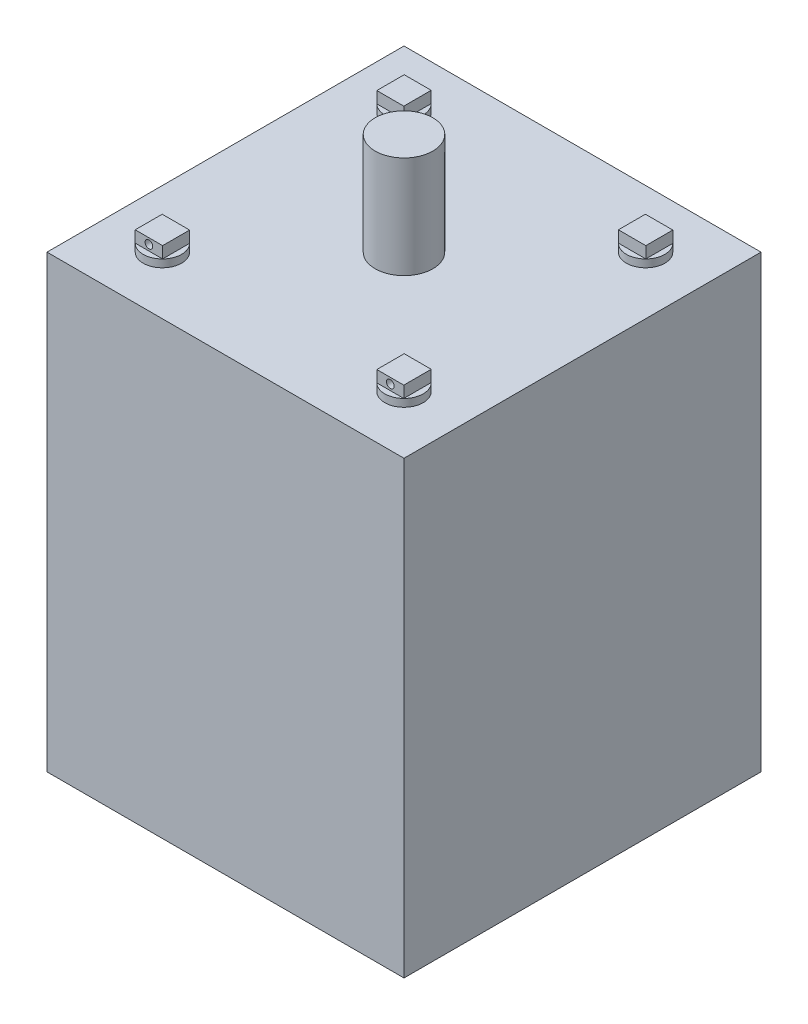
ISO-10303-21;
HEADER;
FILE_DESCRIPTION(('STEP AP214'),'2;1');
FILE_NAME('part.step','',(''),(''),'','','');
FILE_SCHEMA(('AUTOMOTIVE_DESIGN { 1 0 10303 214 1 1 1 1 }'));
ENDSEC;
DATA;
#1=APPLICATION_CONTEXT('core data for automotive mechanical design processes');
#2=APPLICATION_PROTOCOL_DEFINITION('international standard','automotive_design',2000,#1);
#3=PRODUCT_CONTEXT('',#1,'mechanical');
#4=PRODUCT('Part','Part','',(#3));
#5=PRODUCT_RELATED_PRODUCT_CATEGORY('part','',(#4));
#6=PRODUCT_DEFINITION_FORMATION('','',#4);
#7=PRODUCT_DEFINITION_CONTEXT('part definition',#1,'design');
#8=PRODUCT_DEFINITION('design','',#6,#7);
#9=PRODUCT_DEFINITION_SHAPE('','',#8);
#10=(LENGTH_UNIT() NAMED_UNIT(*) SI_UNIT(.MILLI.,.METRE.));
#11=(NAMED_UNIT(*) PLANE_ANGLE_UNIT() SI_UNIT($,.RADIAN.));
#12=(NAMED_UNIT(*) SI_UNIT($,.STERADIAN.) SOLID_ANGLE_UNIT());
#13=UNCERTAINTY_MEASURE_WITH_UNIT(LENGTH_MEASURE(1.E-05),#10,'distance_accuracy_value','');
#14=(GEOMETRIC_REPRESENTATION_CONTEXT(3) GLOBAL_UNCERTAINTY_ASSIGNED_CONTEXT((#13)) GLOBAL_UNIT_ASSIGNED_CONTEXT((#10,
#11,#12)) REPRESENTATION_CONTEXT('',''));
#15=CARTESIAN_POINT('',(0.,0.,0.));
#16=DIRECTION('',(0.,0.,1.));
#17=DIRECTION('',(1.,0.,0.));
#18=AXIS2_PLACEMENT_3D('',#15,#16,#17);
#19=CARTESIAN_POINT('',(92.7999999999995,119.,4.85722573273506E-13));
#20=DIRECTION('',(0.,1.,0.));
#21=DIRECTION('',(1.,0.,0.));
#22=AXIS2_PLACEMENT_3D('',#19,#20,#21);
#23=PLANE('',#22);
#24=CARTESIAN_POINT('',(14.9999999999997,119.,-15.0000000000003));
#25=DIRECTION('',(0.,1.,0.));
#26=DIRECTION('',(1.,0.,0.));
#27=AXIS2_PLACEMENT_3D('',#24,#25,#26);
#28=CIRCLE('',#27,5.);
#29=CARTESIAN_POINT('',(18.5619327146087,119.,-18.5089364965186));
#30=VERTEX_POINT('',#29);
#31=CARTESIAN_POINT('',(11.4380672853907,119.,-18.5089364965187));
#32=VERTEX_POINT('',#31);
#33=EDGE_CURVE('E218',#30,#32,#28,.T.);
#34=ORIENTED_EDGE('',*,*,#33,.T.);
#35=DIRECTION('',(1.,0.,0.));
#36=VECTOR('',#35,1.);
#37=CARTESIAN_POINT('',(92.7999999999997,119.,-18.5089364965179));
#38=LINE('',#37,#36);
#39=EDGE_CURVE('E262',#32,#30,#38,.T.);
#40=ORIENTED_EDGE('',*,*,#39,.T.);
#41=EDGE_LOOP('',(#34,#40));
#42=FACE_BOUND('',#41,.T.);
#43=ADVANCED_FACE('F47',(#42),#23,.T.);
#44=CARTESIAN_POINT('',(18.5619327146086,119.,-11.491063503482));
#45=VERTEX_POINT('',#44);
#46=EDGE_CURVE('E213',#45,#30,#28,.T.);
#47=ORIENTED_EDGE('',*,*,#46,.T.);
#48=DIRECTION('',(0.,0.,1.));
#49=VECTOR('',#48,1.);
#50=CARTESIAN_POINT('',(18.5619327146085,119.,-2.91879906402665E-13));
#51=LINE('',#50,#49);
#52=EDGE_CURVE('E274',#30,#45,#51,.T.);
#53=ORIENTED_EDGE('',*,*,#52,.T.);
#54=EDGE_LOOP('',(#47,#53));
#55=FACE_BOUND('',#54,.T.);
#56=ADVANCED_FACE('F450',(#55),#23,.T.);
#57=DIRECTION('',(0.,0.,1.));
#58=VECTOR('',#57,1.);
#59=CARTESIAN_POINT('',(11.4380672853905,119.,-3.66498436022298E-13));
#60=LINE('',#59,#58);
#61=CARTESIAN_POINT('',(11.4380672853907,119.,-11.491063503482));
#62=VERTEX_POINT('',#61);
#63=EDGE_CURVE('E70',#32,#62,#60,.T.);
#64=ORIENTED_EDGE('',*,*,#63,.F.);
#65=EDGE_CURVE('E300',#32,#62,#28,.T.);
#66=ORIENTED_EDGE('',*,*,#65,.T.);
#67=EDGE_LOOP('',(#64,#66));
#68=FACE_BOUND('',#67,.T.);
#69=ADVANCED_FACE('F458',(#68),#23,.T.);
#70=CARTESIAN_POINT('',(92.8,119.,-92.8));
#71=DIRECTION('',(0.,1.,0.));
#72=DIRECTION('',(0.,0.,-1.));
#73=AXIS2_PLACEMENT_3D('',#70,#71,#72);
#74=PLANE('',#73);
#75=CARTESIAN_POINT('',(77.8,119.,-15.));
#76=DIRECTION('',(0.,1.,0.));
#77=DIRECTION('',(0.,0.,-1.));
#78=AXIS2_PLACEMENT_3D('',#75,#76,#77);
#79=CIRCLE('',#78,5.);
#80=CARTESIAN_POINT('',(74.2910635034817,119.,-18.561932714609));
#81=VERTEX_POINT('',#80);
#82=CARTESIAN_POINT('',(74.2910635034817,119.,-11.438067285391));
#83=VERTEX_POINT('',#82);
#84=EDGE_CURVE('E294',#81,#83,#79,.T.);
#85=ORIENTED_EDGE('',*,*,#84,.T.);
#86=DIRECTION('',(0.,0.,-1.));
#87=VECTOR('',#86,1.);
#88=CARTESIAN_POINT('',(74.2910635034817,119.,-92.8));
#89=LINE('',#88,#87);
#90=EDGE_CURVE('E227',#83,#81,#89,.T.);
#91=ORIENTED_EDGE('',*,*,#90,.T.);
#92=EDGE_LOOP('',(#85,#91));
#93=FACE_BOUND('',#92,.T.);
#94=ADVANCED_FACE('F473',(#93),#74,.T.);
#95=CARTESIAN_POINT('',(81.3089364965183,119.,-18.561932714609));
#96=VERTEX_POINT('',#95);
#97=EDGE_CURVE('E297',#96,#81,#79,.T.);
#98=ORIENTED_EDGE('',*,*,#97,.T.);
#99=DIRECTION('',(1.,0.,0.));
#100=VECTOR('',#99,1.);
#101=CARTESIAN_POINT('',(92.8,119.,-18.561932714609));
#102=LINE('',#101,#100);
#103=EDGE_CURVE('E243',#81,#96,#102,.T.);
#104=ORIENTED_EDGE('',*,*,#103,.T.);
#105=EDGE_LOOP('',(#98,#104));
#106=FACE_BOUND('',#105,.T.);
#107=ADVANCED_FACE('F441',(#106),#74,.T.);
#108=DIRECTION('',(1.,0.,0.));
#109=VECTOR('',#108,1.);
#110=CARTESIAN_POINT('',(92.8,119.,-11.438067285391));
#111=LINE('',#110,#109);
#112=CARTESIAN_POINT('',(81.3089364965183,119.,-11.438067285391));
#113=VERTEX_POINT('',#112);
#114=EDGE_CURVE('E236',#83,#113,#111,.T.);
#115=ORIENTED_EDGE('',*,*,#114,.F.);
#116=EDGE_CURVE('E296',#83,#113,#79,.T.);
#117=ORIENTED_EDGE('',*,*,#116,.T.);
#118=EDGE_LOOP('',(#115,#117));
#119=FACE_BOUND('',#118,.T.);
#120=ADVANCED_FACE('F433',(#119),#74,.T.);
#121=CARTESIAN_POINT('',(1.59594559789866E-13,119.,-92.8000000000002));
#122=DIRECTION('',(0.,1.,0.));
#123=DIRECTION('',(-1.,0.,0.));
#124=AXIS2_PLACEMENT_3D('',#121,#122,#123);
#125=PLANE('',#124);
#126=CARTESIAN_POINT('',(77.8000000000001,119.,-77.7999999999999));
#127=DIRECTION('',(0.,1.,0.));
#128=DIRECTION('',(-1.,0.,0.));
#129=AXIS2_PLACEMENT_3D('',#126,#127,#128);
#130=CIRCLE('',#129,5.);
#131=CARTESIAN_POINT('',(74.2380672853911,119.,-74.2910635034816));
#132=VERTEX_POINT('',#131);
#133=CARTESIAN_POINT('',(81.3619327146091,119.,-74.2910635034815));
#134=VERTEX_POINT('',#133);
#135=EDGE_CURVE('E288',#132,#134,#130,.T.);
#136=ORIENTED_EDGE('',*,*,#135,.T.);
#137=DIRECTION('',(-1.,0.,0.));
#138=VECTOR('',#137,1.);
#139=CARTESIAN_POINT('',(0.,119.,-74.2910635034818));
#140=LINE('',#139,#138);
#141=EDGE_CURVE('E209',#134,#132,#140,.T.);
#142=ORIENTED_EDGE('',*,*,#141,.T.);
#143=EDGE_LOOP('',(#136,#142));
#144=FACE_BOUND('',#143,.T.);
#145=ADVANCED_FACE('F431',(#144),#125,.T.);
#146=CARTESIAN_POINT('',(74.2380672853911,119.,-81.3089364965182));
#147=VERTEX_POINT('',#146);
#148=EDGE_CURVE('E293',#147,#132,#130,.T.);
#149=ORIENTED_EDGE('',*,*,#148,.T.);
#150=DIRECTION('',(0.,0.,-1.));
#151=VECTOR('',#150,1.);
#152=CARTESIAN_POINT('',(74.2380672853912,119.,-92.7999999999999));
#153=LINE('',#152,#151);
#154=EDGE_CURVE('E407',#132,#147,#153,.T.);
#155=ORIENTED_EDGE('',*,*,#154,.T.);
#156=EDGE_LOOP('',(#149,#155));
#157=FACE_BOUND('',#156,.T.);
#158=ADVANCED_FACE('F420',(#157),#125,.T.);
#159=DIRECTION('',(0.,0.,-1.));
#160=VECTOR('',#159,1.);
#161=CARTESIAN_POINT('',(81.3619327146091,119.,-92.7999999999999));
#162=LINE('',#161,#160);
#163=CARTESIAN_POINT('',(81.3619327146091,119.,-81.3089364965182));
#164=VERTEX_POINT('',#163);
#165=EDGE_CURVE('E212',#134,#164,#162,.T.);
#166=ORIENTED_EDGE('',*,*,#165,.F.);
#167=EDGE_CURVE('E292',#134,#164,#130,.T.);
#168=ORIENTED_EDGE('',*,*,#167,.T.);
#169=EDGE_LOOP('',(#166,#168));
#170=FACE_BOUND('',#169,.T.);
#171=ADVANCED_FACE('F440',(#170),#125,.T.);
#172=CARTESIAN_POINT('',(0.,119.,0.));
#173=DIRECTION('',(0.,1.,0.));
#174=DIRECTION('',(0.,0.,1.));
#175=AXIS2_PLACEMENT_3D('',#172,#173,#174);
#176=PLANE('',#175);
#177=CARTESIAN_POINT('',(15.,119.,-77.8));
#178=DIRECTION('',(0.,1.,0.));
#179=DIRECTION('',(0.,0.,1.));
#180=AXIS2_PLACEMENT_3D('',#177,#178,#179);
#181=CIRCLE('',#180,5.);
#182=CARTESIAN_POINT('',(18.5089364965183,119.,-74.238067285391));
#183=VERTEX_POINT('',#182);
#184=CARTESIAN_POINT('',(18.5089364965183,119.,-81.361932714609));
#185=VERTEX_POINT('',#184);
#186=EDGE_CURVE('E341',#183,#185,#181,.T.);
#187=ORIENTED_EDGE('',*,*,#186,.T.);
#188=DIRECTION('',(0.,0.,1.));
#189=VECTOR('',#188,1.);
#190=CARTESIAN_POINT('',(18.5089364965183,119.,0.));
#191=LINE('',#190,#189);
#192=EDGE_CURVE('E311',#185,#183,#191,.T.);
#193=ORIENTED_EDGE('',*,*,#192,.T.);
#194=EDGE_LOOP('',(#187,#193));
#195=FACE_BOUND('',#194,.T.);
#196=ADVANCED_FACE('F620',(#195),#176,.T.);
#197=CARTESIAN_POINT('',(11.4910635034817,119.,-74.238067285391));
#198=VERTEX_POINT('',#197);
#199=EDGE_CURVE('E340',#198,#183,#181,.T.);
#200=ORIENTED_EDGE('',*,*,#199,.T.);
#201=DIRECTION('',(-1.,0.,0.));
#202=VECTOR('',#201,1.);
#203=CARTESIAN_POINT('',(0.,119.,-74.238067285391));
#204=LINE('',#203,#202);
#205=EDGE_CURVE('E325',#183,#198,#204,.T.);
#206=ORIENTED_EDGE('',*,*,#205,.T.);
#207=EDGE_LOOP('',(#200,#206));
#208=FACE_BOUND('',#207,.T.);
#209=ADVANCED_FACE('F612',(#208),#176,.T.);
#210=DIRECTION('',(-1.,0.,0.));
#211=VECTOR('',#210,1.);
#212=CARTESIAN_POINT('',(0.,119.,-81.361932714609));
#213=LINE('',#212,#211);
#214=CARTESIAN_POINT('',(11.4910635034817,119.,-81.361932714609));
#215=VERTEX_POINT('',#214);
#216=EDGE_CURVE('E304',#185,#215,#213,.T.);
#217=ORIENTED_EDGE('',*,*,#216,.F.);
#218=EDGE_CURVE('E345',#185,#215,#181,.T.);
#219=ORIENTED_EDGE('',*,*,#218,.T.);
#220=EDGE_LOOP('',(#217,#219));
#221=FACE_BOUND('',#220,.T.);
#222=ADVANCED_FACE('F608',(#221),#176,.T.);
#223=CARTESIAN_POINT('',(0.,117.,0.));
#224=DIRECTION('',(1.,0.,0.));
#225=DIRECTION('',(0.,0.,-1.));
#226=AXIS2_PLACEMENT_3D('',#223,#224,#225);
#227=PLANE('',#226);
#228=DIRECTION('',(0.,0.,1.));
#229=VECTOR('',#228,1.);
#230=CARTESIAN_POINT('',(0.,0.,0.));
#231=LINE('',#230,#229);
#232=CARTESIAN_POINT('',(0.,0.,-92.8));
#233=VERTEX_POINT('',#232);
#234=CARTESIAN_POINT('',(0.,0.,0.));
#235=VERTEX_POINT('',#234);
#236=EDGE_CURVE('E351',#233,#235,#231,.T.);
#237=ORIENTED_EDGE('',*,*,#236,.T.);
#238=DIRECTION('',(0.,-1.,0.));
#239=VECTOR('',#238,1.);
#240=CARTESIAN_POINT('',(0.,117.,0.));
#241=LINE('',#240,#239);
#242=CARTESIAN_POINT('',(0.,117.,0.));
#243=VERTEX_POINT('',#242);
#244=EDGE_CURVE('E378',#243,#235,#241,.T.);
#245=ORIENTED_EDGE('',*,*,#244,.F.);
#246=DIRECTION('',(0.,0.,1.));
#247=VECTOR('',#246,1.);
#248=CARTESIAN_POINT('',(0.,117.,0.));
#249=LINE('',#248,#247);
#250=CARTESIAN_POINT('',(0.,117.,-92.8));
#251=VERTEX_POINT('',#250);
#252=EDGE_CURVE('E352',#251,#243,#249,.T.);
#253=ORIENTED_EDGE('',*,*,#252,.F.);
#254=DIRECTION('',(0.,-1.,0.));
#255=VECTOR('',#254,1.);
#256=CARTESIAN_POINT('',(0.,117.,-92.8));
#257=LINE('',#256,#255);
#258=EDGE_CURVE('E362',#251,#233,#257,.T.);
#259=ORIENTED_EDGE('',*,*,#258,.T.);
#260=EDGE_LOOP('',(#237,#245,#253,#259));
#261=FACE_BOUND('',#260,.T.);
#262=ADVANCED_FACE('F49',(#261),#227,.F.);
#263=CARTESIAN_POINT('',(0.,117.,0.));
#264=DIRECTION('',(0.,0.,-1.));
#265=DIRECTION('',(-1.,0.,0.));
#266=AXIS2_PLACEMENT_3D('',#263,#264,#265);
#267=PLANE('',#266);
#268=DIRECTION('',(1.,0.,0.));
#269=VECTOR('',#268,1.);
#270=CARTESIAN_POINT('',(0.,0.,0.));
#271=LINE('',#270,#269);
#272=CARTESIAN_POINT('',(92.8,0.,0.));
#273=VERTEX_POINT('',#272);
#274=EDGE_CURVE('E365',#235,#273,#271,.T.);
#275=ORIENTED_EDGE('',*,*,#274,.T.);
#276=DIRECTION('',(0.,-1.,0.));
#277=VECTOR('',#276,1.);
#278=CARTESIAN_POINT('',(92.8,117.,0.));
#279=LINE('',#278,#277);
#280=CARTESIAN_POINT('',(92.8,117.,0.));
#281=VERTEX_POINT('',#280);
#282=EDGE_CURVE('E375',#281,#273,#279,.T.);
#283=ORIENTED_EDGE('',*,*,#282,.F.);
#284=DIRECTION('',(1.,0.,0.));
#285=VECTOR('',#284,1.);
#286=CARTESIAN_POINT('',(0.,117.,0.));
#287=LINE('',#286,#285);
#288=EDGE_CURVE('E355',#243,#281,#287,.T.);
#289=ORIENTED_EDGE('',*,*,#288,.F.);
#290=ORIENTED_EDGE('',*,*,#244,.T.);
#291=EDGE_LOOP('',(#275,#283,#289,#290));
#292=FACE_BOUND('',#291,.T.);
#293=ADVANCED_FACE('F581',(#292),#267,.F.);
#294=CARTESIAN_POINT('',(92.8,117.,0.));
#295=DIRECTION('',(-1.,0.,0.));
#296=DIRECTION('',(0.,0.,1.));
#297=AXIS2_PLACEMENT_3D('',#294,#295,#296);
#298=PLANE('',#297);
#299=DIRECTION('',(0.,0.,-1.));
#300=VECTOR('',#299,1.);
#301=CARTESIAN_POINT('',(92.8,0.,0.));
#302=LINE('',#301,#300);
#303=CARTESIAN_POINT('',(92.8,0.,-92.8));
#304=VERTEX_POINT('',#303);
#305=EDGE_CURVE('E367',#273,#304,#302,.T.);
#306=ORIENTED_EDGE('',*,*,#305,.T.);
#307=DIRECTION('',(0.,-1.,0.));
#308=VECTOR('',#307,1.);
#309=CARTESIAN_POINT('',(92.8,117.,-92.8));
#310=LINE('',#309,#308);
#311=CARTESIAN_POINT('',(92.8,117.,-92.8));
#312=VERTEX_POINT('',#311);
#313=EDGE_CURVE('E372',#312,#304,#310,.T.);
#314=ORIENTED_EDGE('',*,*,#313,.F.);
#315=DIRECTION('',(0.,0.,-1.));
#316=VECTOR('',#315,1.);
#317=CARTESIAN_POINT('',(92.8,117.,0.));
#318=LINE('',#317,#316);
#319=EDGE_CURVE('E358',#281,#312,#318,.T.);
#320=ORIENTED_EDGE('',*,*,#319,.F.);
#321=ORIENTED_EDGE('',*,*,#282,.T.);
#322=EDGE_LOOP('',(#306,#314,#320,#321));
#323=FACE_BOUND('',#322,.T.);
#324=ADVANCED_FACE('F586',(#323),#298,.F.);
#325=CARTESIAN_POINT('',(0.,117.,-92.8));
#326=DIRECTION('',(0.,0.,1.));
#327=DIRECTION('',(1.,0.,0.));
#328=AXIS2_PLACEMENT_3D('',#325,#326,#327);
#329=PLANE('',#328);
#330=DIRECTION('',(-1.,0.,0.));
#331=VECTOR('',#330,1.);
#332=CARTESIAN_POINT('',(0.,0.,-92.8));
#333=LINE('',#332,#331);
#334=EDGE_CURVE('E356',#304,#233,#333,.T.);
#335=ORIENTED_EDGE('',*,*,#334,.T.);
#336=ORIENTED_EDGE('',*,*,#258,.F.);
#337=DIRECTION('',(-1.,0.,0.));
#338=VECTOR('',#337,1.);
#339=CARTESIAN_POINT('',(0.,117.,-92.8));
#340=LINE('',#339,#338);
#341=EDGE_CURVE('E360',#312,#251,#340,.T.);
#342=ORIENTED_EDGE('',*,*,#341,.F.);
#343=ORIENTED_EDGE('',*,*,#313,.T.);
#344=EDGE_LOOP('',(#335,#336,#342,#343));
#345=FACE_BOUND('',#344,.T.);
#346=ADVANCED_FACE('F566',(#345),#329,.F.);
#347=CARTESIAN_POINT('',(0.,117.,0.));
#348=DIRECTION('',(0.,-1.,0.));
#349=DIRECTION('',(0.,0.,-1.));
#350=AXIS2_PLACEMENT_3D('',#347,#348,#349);
#351=PLANE('',#350);
#352=CARTESIAN_POINT('',(77.8000000000001,117.,-77.7999999999999));
#353=DIRECTION('',(0.,-1.,0.));
#354=DIRECTION('',(0.,0.,-1.));
#355=AXIS2_PLACEMENT_3D('',#352,#353,#354);
#356=CIRCLE('',#355,5.);
#357=CARTESIAN_POINT('',(77.8000000000001,117.,-82.7999999999999));
#358=VERTEX_POINT('',#357);
#359=EDGE_CURVE('E11',#358,#358,#356,.F.);
#360=ORIENTED_EDGE('',*,*,#359,.F.);
#361=EDGE_LOOP('',(#360));
#362=FACE_BOUND('',#361,.T.);
#363=CARTESIAN_POINT('',(77.8,117.,-15.));
#364=DIRECTION('',(0.,-1.,0.));
#365=DIRECTION('',(0.,0.,-1.));
#366=AXIS2_PLACEMENT_3D('',#363,#364,#365);
#367=CIRCLE('',#366,5.);
#368=CARTESIAN_POINT('',(77.8,117.,-20.));
#369=VERTEX_POINT('',#368);
#370=EDGE_CURVE('E56',#369,#369,#367,.F.);
#371=ORIENTED_EDGE('',*,*,#370,.F.);
#372=EDGE_LOOP('',(#371));
#373=FACE_BOUND('',#372,.T.);
#374=CARTESIAN_POINT('',(14.9999999999997,117.,-15.0000000000003));
#375=DIRECTION('',(0.,-1.,0.));
#376=DIRECTION('',(0.,0.,-1.));
#377=AXIS2_PLACEMENT_3D('',#374,#375,#376);
#378=CIRCLE('',#377,5.);
#379=CARTESIAN_POINT('',(14.9999999999997,117.,-20.0000000000003));
#380=VERTEX_POINT('',#379);
#381=EDGE_CURVE('E384',#380,#380,#378,.F.);
#382=ORIENTED_EDGE('',*,*,#381,.F.);
#383=EDGE_LOOP('',(#382));
#384=FACE_BOUND('',#383,.T.);
#385=CARTESIAN_POINT('',(15.,117.,-77.8));
#386=DIRECTION('',(0.,-1.,0.));
#387=DIRECTION('',(0.,0.,-1.));
#388=AXIS2_PLACEMENT_3D('',#385,#386,#387);
#389=CIRCLE('',#388,5.);
#390=CARTESIAN_POINT('',(15.,117.,-82.8));
#391=VERTEX_POINT('',#390);
#392=EDGE_CURVE('E381',#391,#391,#389,.F.);
#393=ORIENTED_EDGE('',*,*,#392,.F.);
#394=EDGE_LOOP('',(#393));
#395=FACE_BOUND('',#394,.T.);
#396=CARTESIAN_POINT('',(46.4,117.,-46.4));
#397=DIRECTION('',(0.,-1.,0.));
#398=DIRECTION('',(0.,0.,-1.));
#399=AXIS2_PLACEMENT_3D('',#396,#397,#398);
#400=CIRCLE('',#399,7.5);
#401=CARTESIAN_POINT('',(46.4,117.,-53.9));
#402=VERTEX_POINT('',#401);
#403=EDGE_CURVE('E348',#402,#402,#400,.T.);
#404=ORIENTED_EDGE('',*,*,#403,.T.);
#405=EDGE_LOOP('',(#404));
#406=FACE_BOUND('',#405,.T.);
#407=ORIENTED_EDGE('',*,*,#252,.T.);
#408=ORIENTED_EDGE('',*,*,#288,.T.);
#409=ORIENTED_EDGE('',*,*,#319,.T.);
#410=ORIENTED_EDGE('',*,*,#341,.T.);
#411=EDGE_LOOP('',(#407,#408,#409,#410));
#412=FACE_BOUND('',#411,.T.);
#413=ADVANCED_FACE('F562',(#362,#373,#384,#395,#406,#412),#351,.F.);
#414=CARTESIAN_POINT('',(0.,0.,0.));
#415=DIRECTION('',(0.,-1.,0.));
#416=DIRECTION('',(0.,0.,-1.));
#417=AXIS2_PLACEMENT_3D('',#414,#415,#416);
#418=PLANE('',#417);
#419=ORIENTED_EDGE('',*,*,#236,.F.);
#420=ORIENTED_EDGE('',*,*,#334,.F.);
#421=ORIENTED_EDGE('',*,*,#305,.F.);
#422=ORIENTED_EDGE('',*,*,#274,.F.);
#423=EDGE_LOOP('',(#419,#420,#421,#422));
#424=FACE_BOUND('',#423,.T.);
#425=ADVANCED_FACE('F565',(#424),#418,.T.);
#426=CARTESIAN_POINT('',(46.4,143.5,-46.4));
#427=DIRECTION('',(0.,-1.,0.));
#428=DIRECTION('',(0.,0.,-1.));
#429=AXIS2_PLACEMENT_3D('',#426,#427,#428);
#430=CYLINDRICAL_SURFACE('',#429,7.5);
#431=CARTESIAN_POINT('',(46.4,143.5,-46.4));
#432=DIRECTION('',(0.,-1.,0.));
#433=DIRECTION('',(0.,0.,-1.));
#434=AXIS2_PLACEMENT_3D('',#431,#432,#433);
#435=CIRCLE('',#434,7.5);
#436=CARTESIAN_POINT('',(46.4,143.5,-53.9));
#437=VERTEX_POINT('',#436);
#438=EDGE_CURVE('E344',#437,#437,#435,.T.);
#439=ORIENTED_EDGE('',*,*,#438,.T.);
#440=EDGE_LOOP('',(#439));
#441=FACE_BOUND('',#440,.T.);
#442=ORIENTED_EDGE('',*,*,#403,.F.);
#443=EDGE_LOOP('',(#442));
#444=FACE_BOUND('',#443,.T.);
#445=ADVANCED_FACE('F591',(#441,#444),#430,.T.);
#446=CARTESIAN_POINT('',(46.4,143.5,-46.4));
#447=DIRECTION('',(0.,-1.,0.));
#448=DIRECTION('',(0.,0.,-1.));
#449=AXIS2_PLACEMENT_3D('',#446,#447,#448);
#450=PLANE('',#449);
#451=ORIENTED_EDGE('',*,*,#438,.F.);
#452=EDGE_LOOP('',(#451));
#453=FACE_BOUND('',#452,.T.);
#454=ADVANCED_FACE('F597',(#453),#450,.F.);
#455=CARTESIAN_POINT('',(15.,119.,-77.8));
#456=DIRECTION('',(0.,-1.,0.));
#457=DIRECTION('',(0.,0.,-1.));
#458=AXIS2_PLACEMENT_3D('',#455,#456,#457);
#459=CYLINDRICAL_SURFACE('',#458,5.);
#460=ORIENTED_EDGE('',*,*,#186,.F.);
#461=ORIENTED_EDGE('',*,*,#199,.F.);
#462=EDGE_CURVE('E659',#215,#198,#181,.T.);
#463=ORIENTED_EDGE('',*,*,#462,.F.);
#464=ORIENTED_EDGE('',*,*,#218,.F.);
#465=EDGE_LOOP('',(#460,#461,#463,#464));
#466=FACE_BOUND('',#465,.T.);
#467=ORIENTED_EDGE('',*,*,#392,.T.);
#468=EDGE_LOOP('',(#467));
#469=FACE_BOUND('',#468,.T.);
#470=ADVANCED_FACE('F626',(#466,#469),#459,.T.);
#471=DIRECTION('',(0.,0.,1.));
#472=VECTOR('',#471,1.);
#473=CARTESIAN_POINT('',(11.4910635034817,119.,0.));
#474=LINE('',#473,#472);
#475=EDGE_CURVE('E322',#215,#198,#474,.T.);
#476=ORIENTED_EDGE('',*,*,#475,.F.);
#477=ORIENTED_EDGE('',*,*,#462,.T.);
#478=EDGE_LOOP('',(#476,#477));
#479=FACE_BOUND('',#478,.T.);
#480=ADVANCED_FACE('F615',(#479),#176,.T.);
#481=CARTESIAN_POINT('',(0.,122.,-81.361932714609));
#482=DIRECTION('',(0.,0.,1.));
#483=DIRECTION('',(1.,0.,0.));
#484=AXIS2_PLACEMENT_3D('',#481,#482,#483);
#485=PLANE('',#484);
#486=CARTESIAN_POINT('',(15.,120.5,-81.361932714609));
#487=DIRECTION('',(0.,0.,-1.));
#488=DIRECTION('',(-1.,0.,0.));
#489=AXIS2_PLACEMENT_3D('',#486,#487,#488);
#490=CIRCLE('',#489,1.);
#491=CARTESIAN_POINT('',(14.,120.5,-81.361932714609));
#492=VERTEX_POINT('',#491);
#493=EDGE_CURVE('E291',#492,#492,#490,.T.);
#494=ORIENTED_EDGE('',*,*,#493,.F.);
#495=EDGE_LOOP('',(#494));
#496=FACE_BOUND('',#495,.T.);
#497=ORIENTED_EDGE('',*,*,#216,.T.);
#498=DIRECTION('',(0.,-1.,0.));
#499=VECTOR('',#498,1.);
#500=CARTESIAN_POINT('',(11.4910635034817,122.,-81.361932714609));
#501=LINE('',#500,#499);
#502=CARTESIAN_POINT('',(11.4910635034817,122.,-81.361932714609));
#503=VERTEX_POINT('',#502);
#504=EDGE_CURVE('E337',#503,#215,#501,.T.);
#505=ORIENTED_EDGE('',*,*,#504,.F.);
#506=DIRECTION('',(-1.,0.,0.));
#507=VECTOR('',#506,1.);
#508=CARTESIAN_POINT('',(0.,122.,-81.361932714609));
#509=LINE('',#508,#507);
#510=CARTESIAN_POINT('',(18.5089364965183,122.,-81.361932714609));
#511=VERTEX_POINT('',#510);
#512=EDGE_CURVE('E307',#511,#503,#509,.T.);
#513=ORIENTED_EDGE('',*,*,#512,.F.);
#514=DIRECTION('',(0.,-1.,0.));
#515=VECTOR('',#514,1.);
#516=CARTESIAN_POINT('',(18.5089364965183,122.,-81.361932714609));
#517=LINE('',#516,#515);
#518=EDGE_CURVE('E319',#511,#185,#517,.T.);
#519=ORIENTED_EDGE('',*,*,#518,.T.);
#520=EDGE_LOOP('',(#497,#505,#513,#519));
#521=FACE_BOUND('',#520,.T.);
#522=ADVANCED_FACE('F625',(#496,#521),#485,.F.);
#523=CARTESIAN_POINT('',(11.4910635034817,122.,0.));
#524=DIRECTION('',(1.,0.,0.));
#525=DIRECTION('',(0.,0.,-1.));
#526=AXIS2_PLACEMENT_3D('',#523,#524,#525);
#527=PLANE('',#526);
#528=ORIENTED_EDGE('',*,*,#475,.T.);
#529=DIRECTION('',(0.,-1.,0.));
#530=VECTOR('',#529,1.);
#531=CARTESIAN_POINT('',(11.4910635034817,122.,-74.238067285391));
#532=LINE('',#531,#530);
#533=CARTESIAN_POINT('',(11.4910635034817,122.,-74.238067285391));
#534=VERTEX_POINT('',#533);
#535=EDGE_CURVE('E334',#534,#198,#532,.T.);
#536=ORIENTED_EDGE('',*,*,#535,.F.);
#537=DIRECTION('',(0.,0.,1.));
#538=VECTOR('',#537,1.);
#539=CARTESIAN_POINT('',(11.4910635034817,122.,0.));
#540=LINE('',#539,#538);
#541=EDGE_CURVE('E310',#503,#534,#540,.T.);
#542=ORIENTED_EDGE('',*,*,#541,.F.);
#543=ORIENTED_EDGE('',*,*,#504,.T.);
#544=EDGE_LOOP('',(#528,#536,#542,#543));
#545=FACE_BOUND('',#544,.T.);
#546=ADVANCED_FACE('F632',(#545),#527,.F.);
#547=CARTESIAN_POINT('',(0.,122.,-74.238067285391));
#548=DIRECTION('',(0.,0.,1.));
#549=DIRECTION('',(1.,0.,0.));
#550=AXIS2_PLACEMENT_3D('',#547,#548,#549);
#551=PLANE('',#550);
#552=ORIENTED_EDGE('',*,*,#205,.F.);
#553=DIRECTION('',(0.,-1.,0.));
#554=VECTOR('',#553,1.);
#555=CARTESIAN_POINT('',(18.5089364965183,122.,-74.238067285391));
#556=LINE('',#555,#554);
#557=CARTESIAN_POINT('',(18.5089364965183,122.,-74.238067285391));
#558=VERTEX_POINT('',#557);
#559=EDGE_CURVE('E331',#558,#183,#556,.T.);
#560=ORIENTED_EDGE('',*,*,#559,.F.);
#561=DIRECTION('',(-1.,0.,0.));
#562=VECTOR('',#561,1.);
#563=CARTESIAN_POINT('',(0.,122.,-74.238067285391));
#564=LINE('',#563,#562);
#565=EDGE_CURVE('E313',#558,#534,#564,.T.);
#566=ORIENTED_EDGE('',*,*,#565,.T.);
#567=ORIENTED_EDGE('',*,*,#535,.T.);
#568=EDGE_LOOP('',(#552,#560,#566,#567));
#569=FACE_BOUND('',#568,.T.);
#570=ADVANCED_FACE('F656',(#569),#551,.T.);
#571=CARTESIAN_POINT('',(18.5089364965183,122.,0.));
#572=DIRECTION('',(1.,0.,0.));
#573=DIRECTION('',(0.,0.,-1.));
#574=AXIS2_PLACEMENT_3D('',#571,#572,#573);
#575=PLANE('',#574);
#576=ORIENTED_EDGE('',*,*,#192,.F.);
#577=ORIENTED_EDGE('',*,*,#518,.F.);
#578=DIRECTION('',(0.,0.,1.));
#579=VECTOR('',#578,1.);
#580=CARTESIAN_POINT('',(18.5089364965183,122.,0.));
#581=LINE('',#580,#579);
#582=EDGE_CURVE('E316',#511,#558,#581,.T.);
#583=ORIENTED_EDGE('',*,*,#582,.T.);
#584=ORIENTED_EDGE('',*,*,#559,.T.);
#585=EDGE_LOOP('',(#576,#577,#583,#584));
#586=FACE_BOUND('',#585,.T.);
#587=ADVANCED_FACE('F652',(#586),#575,.T.);
#588=CARTESIAN_POINT('',(0.,122.,0.));
#589=DIRECTION('',(0.,1.,0.));
#590=DIRECTION('',(0.,0.,1.));
#591=AXIS2_PLACEMENT_3D('',#588,#589,#590);
#592=PLANE('',#591);
#593=ORIENTED_EDGE('',*,*,#512,.T.);
#594=ORIENTED_EDGE('',*,*,#541,.T.);
#595=ORIENTED_EDGE('',*,*,#565,.F.);
#596=ORIENTED_EDGE('',*,*,#582,.F.);
#597=EDGE_LOOP('',(#593,#594,#595,#596));
#598=FACE_BOUND('',#597,.T.);
#599=ADVANCED_FACE('F663',(#598),#592,.T.);
#600=CARTESIAN_POINT('',(15.,120.5,-77.861932714609));
#601=DIRECTION('',(0.,0.,-1.));
#602=DIRECTION('',(-1.,0.,0.));
#603=AXIS2_PLACEMENT_3D('',#600,#601,#602);
#604=CYLINDRICAL_SURFACE('',#603,1.);
#605=CARTESIAN_POINT('',(15.,120.5,-77.861932714609));
#606=DIRECTION('',(0.,0.,-1.));
#607=DIRECTION('',(-1.,0.,0.));
#608=AXIS2_PLACEMENT_3D('',#605,#606,#607);
#609=CIRCLE('',#608,1.);
#610=CARTESIAN_POINT('',(14.,120.5,-77.861932714609));
#611=VERTEX_POINT('',#610);
#612=EDGE_CURVE('E301',#611,#611,#609,.T.);
#613=ORIENTED_EDGE('',*,*,#612,.F.);
#614=EDGE_LOOP('',(#613));
#615=FACE_BOUND('',#614,.T.);
#616=ORIENTED_EDGE('',*,*,#493,.T.);
#617=EDGE_LOOP('',(#616));
#618=FACE_BOUND('',#617,.T.);
#619=ADVANCED_FACE('F665',(#615,#618),#604,.F.);
#620=CARTESIAN_POINT('',(15.,120.5,-77.861932714609));
#621=DIRECTION('',(0.,0.,-1.));
#622=DIRECTION('',(-1.,0.,0.));
#623=AXIS2_PLACEMENT_3D('',#620,#621,#622);
#624=PLANE('',#623);
#625=ORIENTED_EDGE('',*,*,#612,.T.);
#626=EDGE_LOOP('',(#625));
#627=FACE_BOUND('',#626,.T.);
#628=ADVANCED_FACE('F470',(#627),#624,.T.);
#629=CARTESIAN_POINT('',(14.9999999999997,119.,-15.0000000000003));
#630=DIRECTION('',(0.,-1.,0.));
#631=DIRECTION('',(0.,0.,-1.));
#632=AXIS2_PLACEMENT_3D('',#629,#630,#631);
#633=CYLINDRICAL_SURFACE('',#632,5.);
#634=ORIENTED_EDGE('',*,*,#33,.F.);
#635=ORIENTED_EDGE('',*,*,#46,.F.);
#636=EDGE_CURVE('E216',#62,#45,#28,.T.);
#637=ORIENTED_EDGE('',*,*,#636,.F.);
#638=ORIENTED_EDGE('',*,*,#65,.F.);
#639=EDGE_LOOP('',(#634,#635,#637,#638));
#640=FACE_BOUND('',#639,.T.);
#641=ORIENTED_EDGE('',*,*,#381,.T.);
#642=EDGE_LOOP('',(#641));
#643=FACE_BOUND('',#642,.T.);
#644=ADVANCED_FACE('F464',(#640,#643),#633,.T.);
#645=DIRECTION('',(1.,0.,0.));
#646=VECTOR('',#645,1.);
#647=CARTESIAN_POINT('',(92.7999999999996,119.,-11.4910635034812));
#648=LINE('',#647,#646);
#649=EDGE_CURVE('E63',#62,#45,#648,.T.);
#650=ORIENTED_EDGE('',*,*,#649,.F.);
#651=ORIENTED_EDGE('',*,*,#636,.T.);
#652=EDGE_LOOP('',(#650,#651));
#653=FACE_BOUND('',#652,.T.);
#654=ADVANCED_FACE('F453',(#653),#23,.T.);
#655=CARTESIAN_POINT('',(77.8,119.,-15.));
#656=DIRECTION('',(0.,-1.,0.));
#657=DIRECTION('',(0.,0.,-1.));
#658=AXIS2_PLACEMENT_3D('',#655,#656,#657);
#659=CYLINDRICAL_SURFACE('',#658,5.);
#660=ORIENTED_EDGE('',*,*,#84,.F.);
#661=ORIENTED_EDGE('',*,*,#97,.F.);
#662=EDGE_CURVE('E488',#113,#96,#79,.T.);
#663=ORIENTED_EDGE('',*,*,#662,.F.);
#664=ORIENTED_EDGE('',*,*,#116,.F.);
#665=EDGE_LOOP('',(#660,#661,#663,#664));
#666=FACE_BOUND('',#665,.T.);
#667=ORIENTED_EDGE('',*,*,#370,.T.);
#668=EDGE_LOOP('',(#667));
#669=FACE_BOUND('',#668,.T.);
#670=ADVANCED_FACE('F463',(#666,#669),#659,.T.);
#671=DIRECTION('',(0.,0.,-1.));
#672=VECTOR('',#671,1.);
#673=CARTESIAN_POINT('',(81.3089364965183,119.,-92.8));
#674=LINE('',#673,#672);
#675=EDGE_CURVE('E239',#113,#96,#674,.T.);
#676=ORIENTED_EDGE('',*,*,#675,.F.);
#677=ORIENTED_EDGE('',*,*,#662,.T.);
#678=EDGE_LOOP('',(#676,#677));
#679=FACE_BOUND('',#678,.T.);
#680=ADVANCED_FACE('F444',(#679),#74,.T.);
#681=CARTESIAN_POINT('',(77.8000000000001,119.,-77.7999999999999));
#682=DIRECTION('',(0.,-1.,0.));
#683=DIRECTION('',(0.,0.,-1.));
#684=AXIS2_PLACEMENT_3D('',#681,#682,#683);
#685=CYLINDRICAL_SURFACE('',#684,5.);
#686=ORIENTED_EDGE('',*,*,#135,.F.);
#687=ORIENTED_EDGE('',*,*,#148,.F.);
#688=EDGE_CURVE('E425',#164,#147,#130,.T.);
#689=ORIENTED_EDGE('',*,*,#688,.F.);
#690=ORIENTED_EDGE('',*,*,#167,.F.);
#691=EDGE_LOOP('',(#686,#687,#689,#690));
#692=FACE_BOUND('',#691,.T.);
#693=ORIENTED_EDGE('',*,*,#359,.T.);
#694=EDGE_LOOP('',(#693));
#695=FACE_BOUND('',#694,.T.);
#696=ADVANCED_FACE('F427',(#692,#695),#685,.T.);
#697=DIRECTION('',(-1.,0.,0.));
#698=VECTOR('',#697,1.);
#699=CARTESIAN_POINT('',(1.19473726003999E-13,119.,-81.3089364965185));
#700=LINE('',#699,#698);
#701=EDGE_CURVE('E405',#164,#147,#700,.T.);
#702=ORIENTED_EDGE('',*,*,#701,.F.);
#703=ORIENTED_EDGE('',*,*,#688,.T.);
#704=EDGE_LOOP('',(#702,#703));
#705=FACE_BOUND('',#704,.T.);
#706=ADVANCED_FACE('F435',(#705),#125,.T.);
#707=CARTESIAN_POINT('',(81.3619327146091,122.,-92.7999999999999));
#708=DIRECTION('',(-1.,0.,0.));
#709=DIRECTION('',(0.,0.,1.));
#710=AXIS2_PLACEMENT_3D('',#707,#708,#709);
#711=PLANE('',#710);
#712=ORIENTED_EDGE('',*,*,#165,.T.);
#713=DIRECTION('',(0.,-1.,0.));
#714=VECTOR('',#713,1.);
#715=CARTESIAN_POINT('',(81.3619327146091,122.,-81.3089364965182));
#716=LINE('',#715,#714);
#717=CARTESIAN_POINT('',(81.3619327146091,122.,-81.3089364965182));
#718=VERTEX_POINT('',#717);
#719=EDGE_CURVE('E192',#718,#164,#716,.T.);
#720=ORIENTED_EDGE('',*,*,#719,.F.);
#721=DIRECTION('',(0.,0.,-1.));
#722=VECTOR('',#721,1.);
#723=CARTESIAN_POINT('',(81.3619327146091,122.,-92.7999999999999));
#724=LINE('',#723,#722);
#725=CARTESIAN_POINT('',(81.3619327146091,122.,-74.2910635034815));
#726=VERTEX_POINT('',#725);
#727=EDGE_CURVE('E200',#726,#718,#724,.T.);
#728=ORIENTED_EDGE('',*,*,#727,.F.);
#729=DIRECTION('',(0.,-1.,0.));
#730=VECTOR('',#729,1.);
#731=CARTESIAN_POINT('',(81.3619327146091,122.,-74.2910635034815));
#732=LINE('',#731,#730);
#733=EDGE_CURVE('E403',#726,#134,#732,.T.);
#734=ORIENTED_EDGE('',*,*,#733,.T.);
#735=EDGE_LOOP('',(#712,#720,#728,#734));
#736=FACE_BOUND('',#735,.T.);
#737=ADVANCED_FACE('F211',(#736),#711,.F.);
#738=CARTESIAN_POINT('',(1.19473726003999E-13,122.,-81.3089364965185));
#739=DIRECTION('',(0.,0.,1.));
#740=DIRECTION('',(1.,0.,0.));
#741=AXIS2_PLACEMENT_3D('',#738,#739,#740);
#742=PLANE('',#741);
#743=CARTESIAN_POINT('',(77.8,120.5,-81.3089364965182));
#744=DIRECTION('',(0.,0.,1.));
#745=DIRECTION('',(1.,0.,0.));
#746=AXIS2_PLACEMENT_3D('',#743,#744,#745);
#747=CIRCLE('',#746,1.);
#748=CARTESIAN_POINT('',(78.8,120.5,-81.3089364965182));
#749=VERTEX_POINT('',#748);
#750=EDGE_CURVE('E51',#749,#749,#747,.F.);
#751=ORIENTED_EDGE('',*,*,#750,.F.);
#752=EDGE_LOOP('',(#751));
#753=FACE_BOUND('',#752,.T.);
#754=ORIENTED_EDGE('',*,*,#701,.T.);
#755=DIRECTION('',(0.,-1.,0.));
#756=VECTOR('',#755,1.);
#757=CARTESIAN_POINT('',(74.2380672853911,122.,-81.3089364965182));
#758=LINE('',#757,#756);
#759=CARTESIAN_POINT('',(74.2380672853911,122.,-81.3089364965182));
#760=VERTEX_POINT('',#759);
#761=EDGE_CURVE('E195',#760,#147,#758,.T.);
#762=ORIENTED_EDGE('',*,*,#761,.F.);
#763=DIRECTION('',(-1.,0.,0.));
#764=VECTOR('',#763,1.);
#765=CARTESIAN_POINT('',(1.19473726003999E-13,122.,-81.3089364965185));
#766=LINE('',#765,#764);
#767=EDGE_CURVE('E187',#718,#760,#766,.T.);
#768=ORIENTED_EDGE('',*,*,#767,.F.);
#769=ORIENTED_EDGE('',*,*,#719,.T.);
#770=EDGE_LOOP('',(#754,#762,#768,#769));
#771=FACE_BOUND('',#770,.T.);
#772=ADVANCED_FACE('F190',(#753,#771),#742,.F.);
#773=CARTESIAN_POINT('',(74.2380672853912,122.,-92.7999999999999));
#774=DIRECTION('',(-1.,0.,0.));
#775=DIRECTION('',(0.,0.,1.));
#776=AXIS2_PLACEMENT_3D('',#773,#774,#775);
#777=PLANE('',#776);
#778=ORIENTED_EDGE('',*,*,#154,.F.);
#779=DIRECTION('',(0.,-1.,0.));
#780=VECTOR('',#779,1.);
#781=CARTESIAN_POINT('',(74.2380672853911,122.,-74.2910635034816));
#782=LINE('',#781,#780);
#783=CARTESIAN_POINT('',(74.2380672853911,122.,-74.2910635034816));
#784=VERTEX_POINT('',#783);
#785=EDGE_CURVE('E219',#784,#132,#782,.T.);
#786=ORIENTED_EDGE('',*,*,#785,.F.);
#787=DIRECTION('',(0.,0.,-1.));
#788=VECTOR('',#787,1.);
#789=CARTESIAN_POINT('',(74.2380672853912,122.,-92.7999999999999));
#790=LINE('',#789,#788);
#791=EDGE_CURVE('E199',#784,#760,#790,.T.);
#792=ORIENTED_EDGE('',*,*,#791,.T.);
#793=ORIENTED_EDGE('',*,*,#761,.T.);
#794=EDGE_LOOP('',(#778,#786,#792,#793));
#795=FACE_BOUND('',#794,.T.);
#796=ADVANCED_FACE('F417',(#795),#777,.T.);
#797=CARTESIAN_POINT('',(0.,122.,-74.2910635034818));
#798=DIRECTION('',(0.,0.,1.));
#799=DIRECTION('',(1.,0.,0.));
#800=AXIS2_PLACEMENT_3D('',#797,#798,#799);
#801=PLANE('',#800);
#802=ORIENTED_EDGE('',*,*,#141,.F.);
#803=ORIENTED_EDGE('',*,*,#733,.F.);
#804=DIRECTION('',(-1.,0.,0.));
#805=VECTOR('',#804,1.);
#806=CARTESIAN_POINT('',(0.,122.,-74.2910635034818));
#807=LINE('',#806,#805);
#808=EDGE_CURVE('E206',#726,#784,#807,.T.);
#809=ORIENTED_EDGE('',*,*,#808,.T.);
#810=ORIENTED_EDGE('',*,*,#785,.T.);
#811=EDGE_LOOP('',(#802,#803,#809,#810));
#812=FACE_BOUND('',#811,.T.);
#813=ADVANCED_FACE('F415',(#812),#801,.T.);
#814=CARTESIAN_POINT('',(1.59594559789866E-13,122.,-92.8000000000002));
#815=DIRECTION('',(0.,1.,0.));
#816=DIRECTION('',(-1.,0.,0.));
#817=AXIS2_PLACEMENT_3D('',#814,#815,#816);
#818=PLANE('',#817);
#819=ORIENTED_EDGE('',*,*,#727,.T.);
#820=ORIENTED_EDGE('',*,*,#767,.T.);
#821=ORIENTED_EDGE('',*,*,#791,.F.);
#822=ORIENTED_EDGE('',*,*,#808,.F.);
#823=EDGE_LOOP('',(#819,#820,#821,#822));
#824=FACE_BOUND('',#823,.T.);
#825=ADVANCED_FACE('F204',(#824),#818,.T.);
#826=CARTESIAN_POINT('',(92.8,122.,-11.438067285391));
#827=DIRECTION('',(0.,0.,-1.));
#828=DIRECTION('',(-1.,0.,0.));
#829=AXIS2_PLACEMENT_3D('',#826,#827,#828);
#830=PLANE('',#829);
#831=CARTESIAN_POINT('',(77.8,120.5,-11.438067285391));
#832=DIRECTION('',(0.,0.,1.));
#833=DIRECTION('',(1.,0.,0.));
#834=AXIS2_PLACEMENT_3D('',#831,#832,#833);
#835=CIRCLE('',#834,1.);
#836=CARTESIAN_POINT('',(78.8,120.5,-11.438067285391));
#837=VERTEX_POINT('',#836);
#838=EDGE_CURVE('E979',#837,#837,#835,.T.);
#839=ORIENTED_EDGE('',*,*,#838,.F.);
#840=EDGE_LOOP('',(#839));
#841=FACE_BOUND('',#840,.T.);
#842=ORIENTED_EDGE('',*,*,#114,.T.);
#843=DIRECTION('',(0.,-1.,0.));
#844=VECTOR('',#843,1.);
#845=CARTESIAN_POINT('',(81.3089364965183,122.,-11.438067285391));
#846=LINE('',#845,#844);
#847=CARTESIAN_POINT('',(81.3089364965183,122.,-11.438067285391));
#848=VERTEX_POINT('',#847);
#849=EDGE_CURVE('E255',#848,#113,#846,.T.);
#850=ORIENTED_EDGE('',*,*,#849,.F.);
#851=DIRECTION('',(1.,0.,0.));
#852=VECTOR('',#851,1.);
#853=CARTESIAN_POINT('',(92.8,122.,-11.438067285391));
#854=LINE('',#853,#852);
#855=CARTESIAN_POINT('',(74.2910635034817,122.,-11.438067285391));
#856=VERTEX_POINT('',#855);
#857=EDGE_CURVE('E223',#856,#848,#854,.T.);
#858=ORIENTED_EDGE('',*,*,#857,.F.);
#859=DIRECTION('',(0.,-1.,0.));
#860=VECTOR('',#859,1.);
#861=CARTESIAN_POINT('',(74.2910635034817,122.,-11.438067285391));
#862=LINE('',#861,#860);
#863=EDGE_CURVE('E235',#856,#83,#862,.T.);
#864=ORIENTED_EDGE('',*,*,#863,.T.);
#865=EDGE_LOOP('',(#842,#850,#858,#864));
#866=FACE_BOUND('',#865,.T.);
#867=ADVANCED_FACE('F501',(#841,#866),#830,.F.);
#868=CARTESIAN_POINT('',(81.3089364965183,122.,-92.8));
#869=DIRECTION('',(-1.,0.,0.));
#870=DIRECTION('',(0.,0.,1.));
#871=AXIS2_PLACEMENT_3D('',#868,#869,#870);
#872=PLANE('',#871);
#873=ORIENTED_EDGE('',*,*,#675,.T.);
#874=DIRECTION('',(0.,-1.,0.));
#875=VECTOR('',#874,1.);
#876=CARTESIAN_POINT('',(81.3089364965183,122.,-18.561932714609));
#877=LINE('',#876,#875);
#878=CARTESIAN_POINT('',(81.3089364965183,122.,-18.561932714609));
#879=VERTEX_POINT('',#878);
#880=EDGE_CURVE('E252',#879,#96,#877,.T.);
#881=ORIENTED_EDGE('',*,*,#880,.F.);
#882=DIRECTION('',(0.,0.,-1.));
#883=VECTOR('',#882,1.);
#884=CARTESIAN_POINT('',(81.3089364965183,122.,-92.8));
#885=LINE('',#884,#883);
#886=EDGE_CURVE('E226',#848,#879,#885,.T.);
#887=ORIENTED_EDGE('',*,*,#886,.F.);
#888=ORIENTED_EDGE('',*,*,#849,.T.);
#889=EDGE_LOOP('',(#873,#881,#887,#888));
#890=FACE_BOUND('',#889,.T.);
#891=ADVANCED_FACE('F498',(#890),#872,.F.);
#892=CARTESIAN_POINT('',(92.8,122.,-18.561932714609));
#893=DIRECTION('',(0.,0.,-1.));
#894=DIRECTION('',(-1.,0.,0.));
#895=AXIS2_PLACEMENT_3D('',#892,#893,#894);
#896=PLANE('',#895);
#897=ORIENTED_EDGE('',*,*,#103,.F.);
#898=DIRECTION('',(0.,-1.,0.));
#899=VECTOR('',#898,1.);
#900=CARTESIAN_POINT('',(74.2910635034817,122.,-18.561932714609));
#901=LINE('',#900,#899);
#902=CARTESIAN_POINT('',(74.2910635034817,122.,-18.561932714609));
#903=VERTEX_POINT('',#902);
#904=EDGE_CURVE('E249',#903,#81,#901,.T.);
#905=ORIENTED_EDGE('',*,*,#904,.F.);
#906=DIRECTION('',(1.,0.,0.));
#907=VECTOR('',#906,1.);
#908=CARTESIAN_POINT('',(92.8,122.,-18.561932714609));
#909=LINE('',#908,#907);
#910=EDGE_CURVE('E229',#903,#879,#909,.T.);
#911=ORIENTED_EDGE('',*,*,#910,.T.);
#912=ORIENTED_EDGE('',*,*,#880,.T.);
#913=EDGE_LOOP('',(#897,#905,#911,#912));
#914=FACE_BOUND('',#913,.T.);
#915=ADVANCED_FACE('F508',(#914),#896,.T.);
#916=CARTESIAN_POINT('',(74.2910635034817,122.,-92.8));
#917=DIRECTION('',(-1.,0.,0.));
#918=DIRECTION('',(0.,0.,1.));
#919=AXIS2_PLACEMENT_3D('',#916,#917,#918);
#920=PLANE('',#919);
#921=ORIENTED_EDGE('',*,*,#90,.F.);
#922=ORIENTED_EDGE('',*,*,#863,.F.);
#923=DIRECTION('',(0.,0.,-1.));
#924=VECTOR('',#923,1.);
#925=CARTESIAN_POINT('',(74.2910635034817,122.,-92.8));
#926=LINE('',#925,#924);
#927=EDGE_CURVE('E232',#856,#903,#926,.T.);
#928=ORIENTED_EDGE('',*,*,#927,.T.);
#929=ORIENTED_EDGE('',*,*,#904,.T.);
#930=EDGE_LOOP('',(#921,#922,#928,#929));
#931=FACE_BOUND('',#930,.T.);
#932=ADVANCED_FACE('F505',(#931),#920,.T.);
#933=CARTESIAN_POINT('',(92.8,122.,-92.8));
#934=DIRECTION('',(0.,1.,0.));
#935=DIRECTION('',(0.,0.,-1.));
#936=AXIS2_PLACEMENT_3D('',#933,#934,#935);
#937=PLANE('',#936);
#938=ORIENTED_EDGE('',*,*,#857,.T.);
#939=ORIENTED_EDGE('',*,*,#886,.T.);
#940=ORIENTED_EDGE('',*,*,#910,.F.);
#941=ORIENTED_EDGE('',*,*,#927,.F.);
#942=EDGE_LOOP('',(#938,#939,#940,#941));
#943=FACE_BOUND('',#942,.T.);
#944=ADVANCED_FACE('F511',(#943),#937,.T.);
#945=CARTESIAN_POINT('',(11.4380672853905,122.,-3.66498436022298E-13));
#946=DIRECTION('',(1.,0.,0.));
#947=DIRECTION('',(0.,0.,-1.));
#948=AXIS2_PLACEMENT_3D('',#945,#946,#947);
#949=PLANE('',#948);
#950=ORIENTED_EDGE('',*,*,#63,.T.);
#951=DIRECTION('',(0.,-1.,0.));
#952=VECTOR('',#951,1.);
#953=CARTESIAN_POINT('',(11.4380672853907,122.,-11.491063503482));
#954=LINE('',#953,#952);
#955=CARTESIAN_POINT('',(11.4380672853907,122.,-11.491063503482));
#956=VERTEX_POINT('',#955);
#957=EDGE_CURVE('E240',#956,#62,#954,.T.);
#958=ORIENTED_EDGE('',*,*,#957,.F.);
#959=DIRECTION('',(0.,0.,1.));
#960=VECTOR('',#959,1.);
#961=CARTESIAN_POINT('',(11.4380672853905,122.,-3.66498436022298E-13));
#962=LINE('',#961,#960);
#963=CARTESIAN_POINT('',(11.4380672853907,122.,-18.5089364965187));
#964=VERTEX_POINT('',#963);
#965=EDGE_CURVE('E258',#964,#956,#962,.T.);
#966=ORIENTED_EDGE('',*,*,#965,.F.);
#967=DIRECTION('',(0.,-1.,0.));
#968=VECTOR('',#967,1.);
#969=CARTESIAN_POINT('',(11.4380672853907,122.,-18.5089364965187));
#970=LINE('',#969,#968);
#971=EDGE_CURVE('E270',#964,#32,#970,.T.);
#972=ORIENTED_EDGE('',*,*,#971,.T.);
#973=EDGE_LOOP('',(#950,#958,#966,#972));
#974=FACE_BOUND('',#973,.T.);
#975=ADVANCED_FACE('F513',(#974),#949,.F.);
#976=CARTESIAN_POINT('',(92.7999999999996,122.,-11.4910635034812));
#977=DIRECTION('',(0.,0.,-1.));
#978=DIRECTION('',(-1.,0.,0.));
#979=AXIS2_PLACEMENT_3D('',#976,#977,#978);
#980=PLANE('',#979);
#981=CARTESIAN_POINT('',(15.,120.5,-11.491063503482));
#982=DIRECTION('',(0.,0.,-1.));
#983=DIRECTION('',(-1.,0.,0.));
#984=AXIS2_PLACEMENT_3D('',#981,#982,#983);
#985=CIRCLE('',#984,1.);
#986=CARTESIAN_POINT('',(14.,120.5,-11.491063503482));
#987=VERTEX_POINT('',#986);
#988=EDGE_CURVE('E272',#987,#987,#985,.F.);
#989=ORIENTED_EDGE('',*,*,#988,.F.);
#990=EDGE_LOOP('',(#989));
#991=FACE_BOUND('',#990,.T.);
#992=ORIENTED_EDGE('',*,*,#649,.T.);
#993=DIRECTION('',(0.,-1.,0.));
#994=VECTOR('',#993,1.);
#995=CARTESIAN_POINT('',(18.5619327146086,122.,-11.491063503482));
#996=LINE('',#995,#994);
#997=CARTESIAN_POINT('',(18.5619327146086,122.,-11.491063503482));
#998=VERTEX_POINT('',#997);
#999=EDGE_CURVE('E283',#998,#45,#996,.T.);
#1000=ORIENTED_EDGE('',*,*,#999,.F.);
#1001=DIRECTION('',(1.,0.,0.));
#1002=VECTOR('',#1001,1.);
#1003=CARTESIAN_POINT('',(92.7999999999996,122.,-11.4910635034812));
#1004=LINE('',#1003,#1002);
#1005=EDGE_CURVE('E261',#956,#998,#1004,.T.);
#1006=ORIENTED_EDGE('',*,*,#1005,.F.);
#1007=ORIENTED_EDGE('',*,*,#957,.T.);
#1008=EDGE_LOOP('',(#992,#1000,#1006,#1007));
#1009=FACE_BOUND('',#1008,.T.);
#1010=ADVANCED_FACE('F519',(#991,#1009),#980,.F.);
#1011=CARTESIAN_POINT('',(18.5619327146085,122.,-2.91879906402665E-13));
#1012=DIRECTION('',(1.,0.,0.));
#1013=DIRECTION('',(0.,0.,-1.));
#1014=AXIS2_PLACEMENT_3D('',#1011,#1012,#1013);
#1015=PLANE('',#1014);
#1016=ORIENTED_EDGE('',*,*,#52,.F.);
#1017=DIRECTION('',(0.,-1.,0.));
#1018=VECTOR('',#1017,1.);
#1019=CARTESIAN_POINT('',(18.5619327146087,122.,-18.5089364965186));
#1020=LINE('',#1019,#1018);
#1021=CARTESIAN_POINT('',(18.5619327146087,122.,-18.5089364965186));
#1022=VERTEX_POINT('',#1021);
#1023=EDGE_CURVE('E280',#1022,#30,#1020,.T.);
#1024=ORIENTED_EDGE('',*,*,#1023,.F.);
#1025=DIRECTION('',(0.,0.,1.));
#1026=VECTOR('',#1025,1.);
#1027=CARTESIAN_POINT('',(18.5619327146085,122.,-2.91879906402665E-13));
#1028=LINE('',#1027,#1026);
#1029=EDGE_CURVE('E264',#1022,#998,#1028,.T.);
#1030=ORIENTED_EDGE('',*,*,#1029,.T.);
#1031=ORIENTED_EDGE('',*,*,#999,.T.);
#1032=EDGE_LOOP('',(#1016,#1024,#1030,#1031));
#1033=FACE_BOUND('',#1032,.T.);
#1034=ADVANCED_FACE('F540',(#1033),#1015,.T.);
#1035=CARTESIAN_POINT('',(92.7999999999997,122.,-18.5089364965179));
#1036=DIRECTION('',(0.,0.,-1.));
#1037=DIRECTION('',(-1.,0.,0.));
#1038=AXIS2_PLACEMENT_3D('',#1035,#1036,#1037);
#1039=PLANE('',#1038);
#1040=ORIENTED_EDGE('',*,*,#39,.F.);
#1041=ORIENTED_EDGE('',*,*,#971,.F.);
#1042=DIRECTION('',(1.,0.,0.));
#1043=VECTOR('',#1042,1.);
#1044=CARTESIAN_POINT('',(92.7999999999997,122.,-18.5089364965179));
#1045=LINE('',#1044,#1043);
#1046=EDGE_CURVE('E267',#964,#1022,#1045,.T.);
#1047=ORIENTED_EDGE('',*,*,#1046,.T.);
#1048=ORIENTED_EDGE('',*,*,#1023,.T.);
#1049=EDGE_LOOP('',(#1040,#1041,#1047,#1048));
#1050=FACE_BOUND('',#1049,.T.);
#1051=ADVANCED_FACE('F536',(#1050),#1039,.T.);
#1052=CARTESIAN_POINT('',(92.7999999999995,122.,4.85722573273506E-13));
#1053=DIRECTION('',(0.,1.,0.));
#1054=DIRECTION('',(1.,0.,0.));
#1055=AXIS2_PLACEMENT_3D('',#1052,#1053,#1054);
#1056=PLANE('',#1055);
#1057=ORIENTED_EDGE('',*,*,#965,.T.);
#1058=ORIENTED_EDGE('',*,*,#1005,.T.);
#1059=ORIENTED_EDGE('',*,*,#1029,.F.);
#1060=ORIENTED_EDGE('',*,*,#1046,.F.);
#1061=EDGE_LOOP('',(#1057,#1058,#1059,#1060));
#1062=FACE_BOUND('',#1061,.T.);
#1063=ADVANCED_FACE('F532',(#1062),#1056,.T.);
#1064=CARTESIAN_POINT('',(15.,120.5,-14.938067285391));
#1065=DIRECTION('',(0.,0.,1.));
#1066=DIRECTION('',(1.,0.,0.));
#1067=AXIS2_PLACEMENT_3D('',#1064,#1065,#1066);
#1068=CYLINDRICAL_SURFACE('',#1067,1.);
#1069=CARTESIAN_POINT('',(15.,120.5,-14.938067285391));
#1070=DIRECTION('',(0.,0.,-1.));
#1071=DIRECTION('',(-1.,0.,0.));
#1072=AXIS2_PLACEMENT_3D('',#1069,#1070,#1071);
#1073=CIRCLE('',#1072,1.);
#1074=CARTESIAN_POINT('',(14.,120.5,-14.938067285391));
#1075=VERTEX_POINT('',#1074);
#1076=EDGE_CURVE('E389',#1075,#1075,#1073,.T.);
#1077=ORIENTED_EDGE('',*,*,#1076,.T.);
#1078=EDGE_LOOP('',(#1077));
#1079=FACE_BOUND('',#1078,.T.);
#1080=ORIENTED_EDGE('',*,*,#988,.T.);
#1081=EDGE_LOOP('',(#1080));
#1082=FACE_BOUND('',#1081,.T.);
#1083=ADVANCED_FACE('F535',(#1079,#1082),#1068,.F.);
#1084=CARTESIAN_POINT('',(15.,120.5,-14.938067285391));
#1085=DIRECTION('',(0.,0.,1.));
#1086=DIRECTION('',(-1.,0.,0.));
#1087=AXIS2_PLACEMENT_3D('',#1084,#1085,#1086);
#1088=PLANE('',#1087);
#1089=ORIENTED_EDGE('',*,*,#1076,.F.);
#1090=EDGE_LOOP('',(#1089));
#1091=FACE_BOUND('',#1090,.T.);
#1092=ADVANCED_FACE('F926',(#1091),#1088,.T.);
#1093=CARTESIAN_POINT('',(77.8,120.5,-77.861932714609));
#1094=DIRECTION('',(0.,0.,-1.));
#1095=DIRECTION('',(-1.,0.,0.));
#1096=AXIS2_PLACEMENT_3D('',#1093,#1094,#1095);
#1097=CYLINDRICAL_SURFACE('',#1096,1.);
#1098=CARTESIAN_POINT('',(77.8,120.5,-77.861932714609));
#1099=DIRECTION('',(0.,0.,1.));
#1100=DIRECTION('',(1.,0.,0.));
#1101=AXIS2_PLACEMENT_3D('',#1098,#1099,#1100);
#1102=CIRCLE('',#1101,1.);
#1103=CARTESIAN_POINT('',(78.8,120.5,-77.861932714609));
#1104=VERTEX_POINT('',#1103);
#1105=EDGE_CURVE('E397',#1104,#1104,#1102,.T.);
#1106=ORIENTED_EDGE('',*,*,#1105,.T.);
#1107=EDGE_LOOP('',(#1106));
#1108=FACE_BOUND('',#1107,.T.);
#1109=ORIENTED_EDGE('',*,*,#750,.T.);
#1110=EDGE_LOOP('',(#1109));
#1111=FACE_BOUND('',#1110,.T.);
#1112=ADVANCED_FACE('F934',(#1108,#1111),#1097,.F.);
#1113=CARTESIAN_POINT('',(77.8,120.5,-77.861932714609));
#1114=DIRECTION('',(0.,0.,-1.));
#1115=DIRECTION('',(1.,0.,0.));
#1116=AXIS2_PLACEMENT_3D('',#1113,#1114,#1115);
#1117=PLANE('',#1116);
#1118=ORIENTED_EDGE('',*,*,#1105,.F.);
#1119=EDGE_LOOP('',(#1118));
#1120=FACE_BOUND('',#1119,.T.);
#1121=ADVANCED_FACE('F943',(#1120),#1117,.T.);
#1122=CARTESIAN_POINT('',(77.8,120.5,-14.938067285391));
#1123=DIRECTION('',(0.,0.,1.));
#1124=DIRECTION('',(1.,0.,0.));
#1125=AXIS2_PLACEMENT_3D('',#1122,#1123,#1124);
#1126=CYLINDRICAL_SURFACE('',#1125,1.);
#1127=CARTESIAN_POINT('',(77.8,120.5,-14.938067285391));
#1128=DIRECTION('',(0.,0.,1.));
#1129=DIRECTION('',(1.,0.,0.));
#1130=AXIS2_PLACEMENT_3D('',#1127,#1128,#1129);
#1131=CIRCLE('',#1130,1.);
#1132=CARTESIAN_POINT('',(78.8,120.5,-14.938067285391));
#1133=VERTEX_POINT('',#1132);
#1134=EDGE_CURVE('E978',#1133,#1133,#1131,.T.);
#1135=ORIENTED_EDGE('',*,*,#1134,.F.);
#1136=EDGE_LOOP('',(#1135));
#1137=FACE_BOUND('',#1136,.T.);
#1138=ORIENTED_EDGE('',*,*,#838,.T.);
#1139=EDGE_LOOP('',(#1138));
#1140=FACE_BOUND('',#1139,.T.);
#1141=ADVANCED_FACE('F953',(#1137,#1140),#1126,.F.);
#1142=CARTESIAN_POINT('',(77.8,120.5,-14.938067285391));
#1143=DIRECTION('',(0.,0.,1.));
#1144=DIRECTION('',(1.,0.,0.));
#1145=AXIS2_PLACEMENT_3D('',#1142,#1143,#1144);
#1146=PLANE('',#1145);
#1147=ORIENTED_EDGE('',*,*,#1134,.T.);
#1148=EDGE_LOOP('',(#1147));
#1149=FACE_BOUND('',#1148,.T.);
#1150=ADVANCED_FACE('F963',(#1149),#1146,.T.);
#1151=CLOSED_SHELL('',(#43,#56,#69,#94,#107,#120,#145,#158,#171,#196,#209,#222,#262,#293,#324,
#346,#413,#425,#445,#454,#470,#480,#522,#546,#570,#587,#599,#619,#628,#644,#654,#670,#680,#696,
#706,#737,#772,#796,#813,#825,#867,#891,#915,#932,#944,#975,#1010,#1034,#1051,#1063,#1083,#1092,
#1112,#1121,#1141,#1150));
#1152=MANIFOLD_SOLID_BREP('B2',#1151);
#1153=ADVANCED_BREP_SHAPE_REPRESENTATION('',(#18,#1152),#14);
#1154=SHAPE_DEFINITION_REPRESENTATION(#9,#1153);
ENDSEC;
END-ISO-10303-21;
